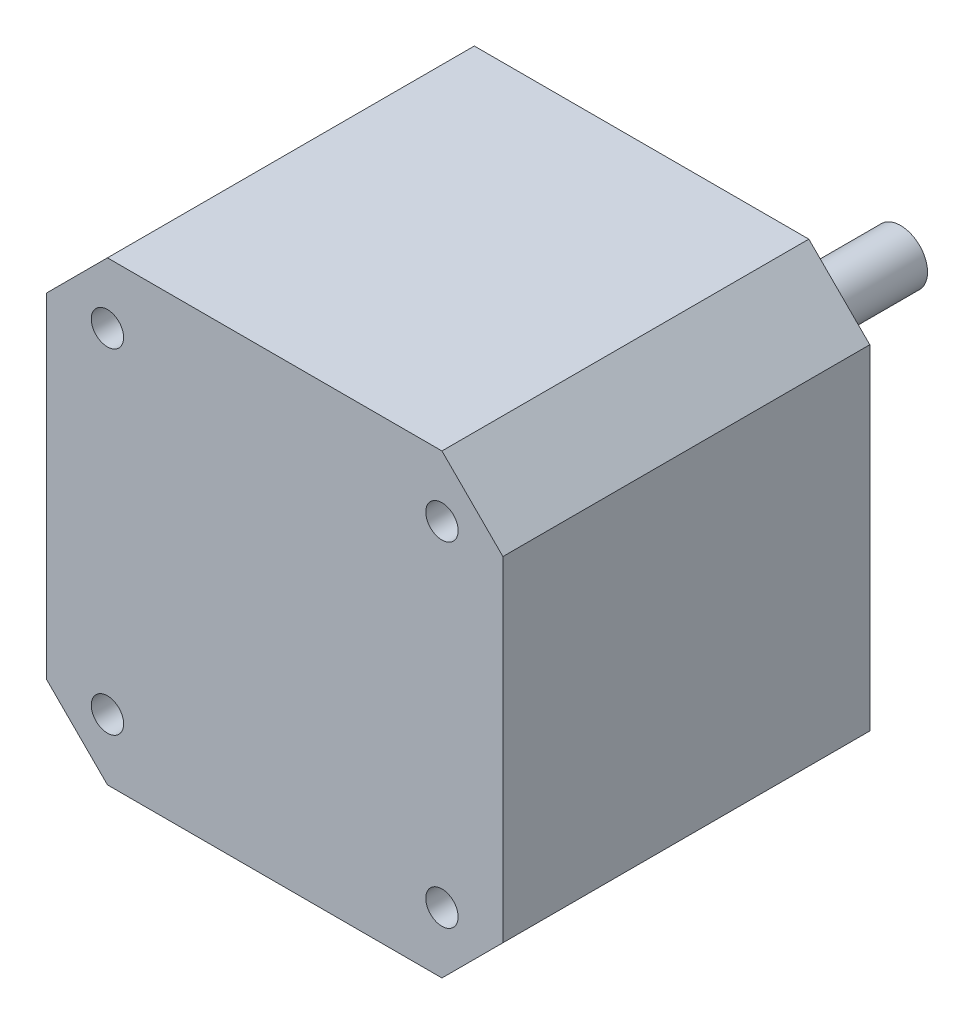
ISO-10303-21;
HEADER;
FILE_DESCRIPTION(('STEP AP214'),'2;1');
FILE_NAME('part.step','',(''),(''),'','','');
FILE_SCHEMA(('AUTOMOTIVE_DESIGN { 1 0 10303 214 1 1 1 1 }'));
ENDSEC;
DATA;
#1=APPLICATION_CONTEXT('core data for automotive mechanical design processes');
#2=APPLICATION_PROTOCOL_DEFINITION('international standard','automotive_design',2000,#1);
#3=PRODUCT_CONTEXT('',#1,'mechanical');
#4=PRODUCT('Part','Part','',(#3));
#5=PRODUCT_RELATED_PRODUCT_CATEGORY('part','',(#4));
#6=PRODUCT_DEFINITION_FORMATION('','',#4);
#7=PRODUCT_DEFINITION_CONTEXT('part definition',#1,'design');
#8=PRODUCT_DEFINITION('design','',#6,#7);
#9=PRODUCT_DEFINITION_SHAPE('','',#8);
#10=(LENGTH_UNIT() NAMED_UNIT(*) SI_UNIT(.MILLI.,.METRE.));
#11=(NAMED_UNIT(*) PLANE_ANGLE_UNIT() SI_UNIT($,.RADIAN.));
#12=(NAMED_UNIT(*) SI_UNIT($,.STERADIAN.) SOLID_ANGLE_UNIT());
#13=UNCERTAINTY_MEASURE_WITH_UNIT(LENGTH_MEASURE(1.E-05),#10,'distance_accuracy_value','');
#14=(GEOMETRIC_REPRESENTATION_CONTEXT(3) GLOBAL_UNCERTAINTY_ASSIGNED_CONTEXT((#13)) GLOBAL_UNIT_ASSIGNED_CONTEXT((#10,
#11,#12)) REPRESENTATION_CONTEXT('',''));
#15=CARTESIAN_POINT('',(0.,0.,0.));
#16=DIRECTION('',(0.,0.,1.));
#17=DIRECTION('',(1.,0.,0.));
#18=AXIS2_PLACEMENT_3D('',#15,#16,#17);
#19=CARTESIAN_POINT('',(0.,0.,34.));
#20=DIRECTION('',(0.,0.,1.));
#21=DIRECTION('',(1.,0.,0.));
#22=AXIS2_PLACEMENT_3D('',#19,#20,#21);
#23=PLANE('',#22);
#24=CARTESIAN_POINT('',(-15.4999999999991,-15.5000000000009,34.));
#25=DIRECTION('',(0.,0.,1.));
#26=DIRECTION('',(1.,0.,0.));
#27=AXIS2_PLACEMENT_3D('',#24,#25,#26);
#28=CIRCLE('',#27,1.50000000000065);
#29=CARTESIAN_POINT('',(-13.9999999999985,-15.5000000000009,34.));
#30=VERTEX_POINT('',#29);
#31=EDGE_CURVE('E188',#30,#30,#28,.T.);
#32=ORIENTED_EDGE('',*,*,#31,.F.);
#33=EDGE_LOOP('',(#32));
#34=FACE_BOUND('',#33,.T.);
#35=CARTESIAN_POINT('',(15.5,15.5,34.));
#36=DIRECTION('',(0.,0.,1.));
#37=DIRECTION('',(1.,0.,0.));
#38=AXIS2_PLACEMENT_3D('',#35,#36,#37);
#39=CIRCLE('',#38,1.5);
#40=CARTESIAN_POINT('',(17.,15.5,34.));
#41=VERTEX_POINT('',#40);
#42=EDGE_CURVE('E134',#41,#41,#39,.T.);
#43=ORIENTED_EDGE('',*,*,#42,.F.);
#44=EDGE_LOOP('',(#43));
#45=FACE_BOUND('',#44,.T.);
#46=DIRECTION('',(-1.,0.,0.));
#47=VECTOR('',#46,1.);
#48=CARTESIAN_POINT('',(-15.5000000000006,21.1499999999994,34.));
#49=LINE('',#48,#47);
#50=CARTESIAN_POINT('',(15.5000000000006,21.1499999999994,34.));
#51=VERTEX_POINT('',#50);
#52=CARTESIAN_POINT('',(-15.5000000000006,21.1499999999994,34.));
#53=VERTEX_POINT('',#52);
#54=EDGE_CURVE('E145',#51,#53,#49,.T.);
#55=ORIENTED_EDGE('',*,*,#54,.T.);
#56=DIRECTION('',(-0.707106781186547,-0.707106781186548,0.));
#57=VECTOR('',#56,1.);
#58=CARTESIAN_POINT('',(-15.5000000000006,21.1499999999994,34.));
#59=LINE('',#58,#57);
#60=CARTESIAN_POINT('',(-21.1499999999993,15.5000000000006,34.));
#61=VERTEX_POINT('',#60);
#62=EDGE_CURVE('E93',#53,#61,#59,.T.);
#63=ORIENTED_EDGE('',*,*,#62,.T.);
#64=DIRECTION('',(0.,-1.,0.));
#65=VECTOR('',#64,1.);
#66=CARTESIAN_POINT('',(-21.1499999999993,-15.5000000000006,34.));
#67=LINE('',#66,#65);
#68=CARTESIAN_POINT('',(-21.1499999999993,-15.5000000000006,34.));
#69=VERTEX_POINT('',#68);
#70=EDGE_CURVE('E160',#61,#69,#67,.T.);
#71=ORIENTED_EDGE('',*,*,#70,.T.);
#72=DIRECTION('',(0.707106781186548,-0.707106781186547,0.));
#73=VECTOR('',#72,1.);
#74=CARTESIAN_POINT('',(-21.1499999999993,-15.5000000000006,34.));
#75=LINE('',#74,#73);
#76=CARTESIAN_POINT('',(-15.5000000000006,-21.1499999999993,34.));
#77=VERTEX_POINT('',#76);
#78=EDGE_CURVE('E173',#69,#77,#75,.T.);
#79=ORIENTED_EDGE('',*,*,#78,.T.);
#80=DIRECTION('',(1.,0.,0.));
#81=VECTOR('',#80,1.);
#82=CARTESIAN_POINT('',(-15.5000000000006,-21.1499999999993,34.));
#83=LINE('',#82,#81);
#84=CARTESIAN_POINT('',(15.5000000000006,-21.1499999999993,34.));
#85=VERTEX_POINT('',#84);
#86=EDGE_CURVE('E112',#77,#85,#83,.T.);
#87=ORIENTED_EDGE('',*,*,#86,.T.);
#88=DIRECTION('',(0.707106781186548,0.707106781186548,0.));
#89=VECTOR('',#88,1.);
#90=CARTESIAN_POINT('',(15.5000000000006,-21.1499999999993,34.));
#91=LINE('',#90,#89);
#92=CARTESIAN_POINT('',(21.1499999999994,-15.5000000000006,34.));
#93=VERTEX_POINT('',#92);
#94=EDGE_CURVE('E106',#85,#93,#91,.T.);
#95=ORIENTED_EDGE('',*,*,#94,.T.);
#96=DIRECTION('',(0.,1.,0.));
#97=VECTOR('',#96,1.);
#98=CARTESIAN_POINT('',(21.1499999999994,-15.5000000000006,34.));
#99=LINE('',#98,#97);
#100=CARTESIAN_POINT('',(21.1499999999994,15.5000000000006,34.));
#101=VERTEX_POINT('',#100);
#102=EDGE_CURVE('E110',#93,#101,#99,.T.);
#103=ORIENTED_EDGE('',*,*,#102,.T.);
#104=DIRECTION('',(-0.707106781186548,0.707106781186547,0.));
#105=VECTOR('',#104,1.);
#106=CARTESIAN_POINT('',(21.1499999999994,15.5000000000006,34.));
#107=LINE('',#106,#105);
#108=EDGE_CURVE('E50',#101,#51,#107,.T.);
#109=ORIENTED_EDGE('',*,*,#108,.T.);
#110=EDGE_LOOP('',(#55,#63,#71,#79,#87,#95,#103,#109));
#111=FACE_BOUND('',#110,.T.);
#112=CARTESIAN_POINT('',(15.5000000000009,-15.5,34.));
#113=DIRECTION('',(0.,0.,1.));
#114=DIRECTION('',(1.,0.,0.));
#115=AXIS2_PLACEMENT_3D('',#112,#113,#114);
#116=CIRCLE('',#115,1.49999999999978);
#117=CARTESIAN_POINT('',(17.0000000000007,-15.5,34.));
#118=VERTEX_POINT('',#117);
#119=EDGE_CURVE('E182',#118,#118,#116,.T.);
#120=ORIENTED_EDGE('',*,*,#119,.F.);
#121=EDGE_LOOP('',(#120));
#122=FACE_BOUND('',#121,.T.);
#123=CARTESIAN_POINT('',(-15.5,15.4999999999991,34.));
#124=DIRECTION('',(0.,0.,1.));
#125=DIRECTION('',(1.,0.,0.));
#126=AXIS2_PLACEMENT_3D('',#123,#124,#125);
#127=CIRCLE('',#126,1.50000000000094);
#128=CARTESIAN_POINT('',(-13.9999999999991,15.4999999999991,34.));
#129=VERTEX_POINT('',#128);
#130=EDGE_CURVE('E194',#129,#129,#127,.T.);
#131=ORIENTED_EDGE('',*,*,#130,.F.);
#132=EDGE_LOOP('',(#131));
#133=FACE_BOUND('',#132,.T.);
#134=ADVANCED_FACE('F33',(#34,#45,#111,#122,#133),#23,.T.);
#135=CARTESIAN_POINT('',(0.,0.,0.));
#136=DIRECTION('',(0.,0.,1.));
#137=DIRECTION('',(1.,0.,0.));
#138=AXIS2_PLACEMENT_3D('',#135,#136,#137);
#139=PLANE('',#138);
#140=CARTESIAN_POINT('',(0.,0.,0.));
#141=DIRECTION('',(0.,0.,1.));
#142=DIRECTION('',(1.,0.,0.));
#143=AXIS2_PLACEMENT_3D('',#140,#141,#142);
#144=CIRCLE('',#143,11.);
#145=CARTESIAN_POINT('',(11.,0.,0.));
#146=VERTEX_POINT('',#145);
#147=EDGE_CURVE('E200',#146,#146,#144,.T.);
#148=ORIENTED_EDGE('',*,*,#147,.T.);
#149=EDGE_LOOP('',(#148));
#150=FACE_BOUND('',#149,.T.);
#151=DIRECTION('',(-1.,0.,0.));
#152=VECTOR('',#151,1.);
#153=CARTESIAN_POINT('',(-15.5000000000006,21.1499999999994,0.));
#154=LINE('',#153,#152);
#155=CARTESIAN_POINT('',(15.5000000000006,21.1499999999994,0.));
#156=VERTEX_POINT('',#155);
#157=CARTESIAN_POINT('',(-15.5000000000006,21.1499999999994,0.));
#158=VERTEX_POINT('',#157);
#159=EDGE_CURVE('E130',#156,#158,#154,.T.);
#160=ORIENTED_EDGE('',*,*,#159,.F.);
#161=DIRECTION('',(-0.707106781186548,0.707106781186547,0.));
#162=VECTOR('',#161,1.);
#163=CARTESIAN_POINT('',(21.1499999999994,15.5000000000006,0.));
#164=LINE('',#163,#162);
#165=CARTESIAN_POINT('',(21.1499999999994,15.5000000000006,0.));
#166=VERTEX_POINT('',#165);
#167=EDGE_CURVE('E85',#166,#156,#164,.T.);
#168=ORIENTED_EDGE('',*,*,#167,.F.);
#169=DIRECTION('',(0.,1.,0.));
#170=VECTOR('',#169,1.);
#171=CARTESIAN_POINT('',(21.1499999999994,-15.5000000000006,0.));
#172=LINE('',#171,#170);
#173=CARTESIAN_POINT('',(21.1499999999994,-15.5000000000006,0.));
#174=VERTEX_POINT('',#173);
#175=EDGE_CURVE('E79',#174,#166,#172,.T.);
#176=ORIENTED_EDGE('',*,*,#175,.F.);
#177=DIRECTION('',(0.707106781186548,0.707106781186548,0.));
#178=VECTOR('',#177,1.);
#179=CARTESIAN_POINT('',(15.5000000000006,-21.1499999999993,0.));
#180=LINE('',#179,#178);
#181=CARTESIAN_POINT('',(15.5000000000006,-21.1499999999993,0.));
#182=VERTEX_POINT('',#181);
#183=EDGE_CURVE('E120',#182,#174,#180,.T.);
#184=ORIENTED_EDGE('',*,*,#183,.F.);
#185=DIRECTION('',(1.,0.,0.));
#186=VECTOR('',#185,1.);
#187=CARTESIAN_POINT('',(-15.5000000000006,-21.1499999999993,0.));
#188=LINE('',#187,#186);
#189=CARTESIAN_POINT('',(-15.5000000000006,-21.1499999999993,0.));
#190=VERTEX_POINT('',#189);
#191=EDGE_CURVE('E140',#190,#182,#188,.T.);
#192=ORIENTED_EDGE('',*,*,#191,.F.);
#193=DIRECTION('',(0.707106781186548,-0.707106781186547,0.));
#194=VECTOR('',#193,1.);
#195=CARTESIAN_POINT('',(-21.1499999999993,-15.5000000000006,0.));
#196=LINE('',#195,#194);
#197=CARTESIAN_POINT('',(-21.1499999999993,-15.5000000000006,0.));
#198=VERTEX_POINT('',#197);
#199=EDGE_CURVE('E138',#198,#190,#196,.T.);
#200=ORIENTED_EDGE('',*,*,#199,.F.);
#201=DIRECTION('',(0.,-1.,0.));
#202=VECTOR('',#201,1.);
#203=CARTESIAN_POINT('',(-21.1499999999993,-15.5000000000006,0.));
#204=LINE('',#203,#202);
#205=CARTESIAN_POINT('',(-21.1499999999993,15.5000000000006,0.));
#206=VERTEX_POINT('',#205);
#207=EDGE_CURVE('E136',#206,#198,#204,.T.);
#208=ORIENTED_EDGE('',*,*,#207,.F.);
#209=DIRECTION('',(-0.707106781186547,-0.707106781186548,0.));
#210=VECTOR('',#209,1.);
#211=CARTESIAN_POINT('',(-15.5000000000006,21.1499999999994,0.));
#212=LINE('',#211,#210);
#213=EDGE_CURVE('E133',#158,#206,#212,.T.);
#214=ORIENTED_EDGE('',*,*,#213,.F.);
#215=EDGE_LOOP('',(#160,#168,#176,#184,#192,#200,#208,#214));
#216=FACE_BOUND('',#215,.T.);
#217=CARTESIAN_POINT('',(15.5,15.5,0.));
#218=DIRECTION('',(0.,0.,1.));
#219=DIRECTION('',(1.,0.,0.));
#220=AXIS2_PLACEMENT_3D('',#217,#218,#219);
#221=CIRCLE('',#220,1.5);
#222=CARTESIAN_POINT('',(17.,15.5,0.));
#223=VERTEX_POINT('',#222);
#224=EDGE_CURVE('E179',#223,#223,#221,.T.);
#225=ORIENTED_EDGE('',*,*,#224,.T.);
#226=EDGE_LOOP('',(#225));
#227=FACE_BOUND('',#226,.T.);
#228=CARTESIAN_POINT('',(15.5000000000009,-15.5,0.));
#229=DIRECTION('',(0.,0.,1.));
#230=DIRECTION('',(1.,0.,0.));
#231=AXIS2_PLACEMENT_3D('',#228,#229,#230);
#232=CIRCLE('',#231,1.49999999999978);
#233=CARTESIAN_POINT('',(17.0000000000007,-15.5,0.));
#234=VERTEX_POINT('',#233);
#235=EDGE_CURVE('E185',#234,#234,#232,.T.);
#236=ORIENTED_EDGE('',*,*,#235,.T.);
#237=EDGE_LOOP('',(#236));
#238=FACE_BOUND('',#237,.T.);
#239=CARTESIAN_POINT('',(-15.4999999999991,-15.5000000000009,0.));
#240=DIRECTION('',(0.,0.,1.));
#241=DIRECTION('',(1.,0.,0.));
#242=AXIS2_PLACEMENT_3D('',#239,#240,#241);
#243=CIRCLE('',#242,1.50000000000065);
#244=CARTESIAN_POINT('',(-13.9999999999985,-15.5000000000009,0.));
#245=VERTEX_POINT('',#244);
#246=EDGE_CURVE('E191',#245,#245,#243,.T.);
#247=ORIENTED_EDGE('',*,*,#246,.T.);
#248=EDGE_LOOP('',(#247));
#249=FACE_BOUND('',#248,.T.);
#250=CARTESIAN_POINT('',(-15.5,15.4999999999991,0.));
#251=DIRECTION('',(0.,0.,1.));
#252=DIRECTION('',(1.,0.,0.));
#253=AXIS2_PLACEMENT_3D('',#250,#251,#252);
#254=CIRCLE('',#253,1.50000000000094);
#255=CARTESIAN_POINT('',(-13.9999999999991,15.4999999999991,0.));
#256=VERTEX_POINT('',#255);
#257=EDGE_CURVE('E197',#256,#256,#254,.T.);
#258=ORIENTED_EDGE('',*,*,#257,.T.);
#259=EDGE_LOOP('',(#258));
#260=FACE_BOUND('',#259,.T.);
#261=ADVANCED_FACE('F164',(#150,#216,#227,#238,#249,#260),#139,.F.);
#262=CARTESIAN_POINT('',(-15.5000000000006,21.1499999999994,34.));
#263=DIRECTION('',(0.,-1.,0.));
#264=DIRECTION('',(1.,0.,0.));
#265=AXIS2_PLACEMENT_3D('',#262,#263,#264);
#266=PLANE('',#265);
#267=ORIENTED_EDGE('',*,*,#159,.T.);
#268=DIRECTION('',(0.,0.,-1.));
#269=VECTOR('',#268,1.);
#270=CARTESIAN_POINT('',(-15.5000000000006,21.1499999999994,34.));
#271=LINE('',#270,#269);
#272=EDGE_CURVE('E11',#53,#158,#271,.T.);
#273=ORIENTED_EDGE('',*,*,#272,.F.);
#274=ORIENTED_EDGE('',*,*,#54,.F.);
#275=DIRECTION('',(0.,0.,-1.));
#276=VECTOR('',#275,1.);
#277=CARTESIAN_POINT('',(15.5000000000006,21.1499999999994,34.));
#278=LINE('',#277,#276);
#279=EDGE_CURVE('E126',#51,#156,#278,.T.);
#280=ORIENTED_EDGE('',*,*,#279,.T.);
#281=EDGE_LOOP('',(#267,#273,#274,#280));
#282=FACE_BOUND('',#281,.T.);
#283=ADVANCED_FACE('F35',(#282),#266,.F.);
#284=CARTESIAN_POINT('',(-15.5000000000006,21.1499999999994,34.));
#285=DIRECTION('',(0.707106781186548,-0.707106781186547,0.));
#286=DIRECTION('',(0.707106781186547,0.707106781186548,0.));
#287=AXIS2_PLACEMENT_3D('',#284,#285,#286);
#288=PLANE('',#287);
#289=ORIENTED_EDGE('',*,*,#213,.T.);
#290=DIRECTION('',(0.,0.,-1.));
#291=VECTOR('',#290,1.);
#292=CARTESIAN_POINT('',(-21.1499999999993,15.5000000000006,34.));
#293=LINE('',#292,#291);
#294=EDGE_CURVE('E42',#61,#206,#293,.T.);
#295=ORIENTED_EDGE('',*,*,#294,.F.);
#296=ORIENTED_EDGE('',*,*,#62,.F.);
#297=ORIENTED_EDGE('',*,*,#272,.T.);
#298=EDGE_LOOP('',(#289,#295,#296,#297));
#299=FACE_BOUND('',#298,.T.);
#300=ADVANCED_FACE('F264',(#299),#288,.F.);
#301=CARTESIAN_POINT('',(-21.1499999999993,-15.5000000000006,34.));
#302=DIRECTION('',(1.,0.,0.));
#303=DIRECTION('',(0.,0.,-1.));
#304=AXIS2_PLACEMENT_3D('',#301,#302,#303);
#305=PLANE('',#304);
#306=ORIENTED_EDGE('',*,*,#207,.T.);
#307=DIRECTION('',(0.,0.,-1.));
#308=VECTOR('',#307,1.);
#309=CARTESIAN_POINT('',(-21.1499999999993,-15.5000000000006,34.));
#310=LINE('',#309,#308);
#311=EDGE_CURVE('E152',#69,#198,#310,.T.);
#312=ORIENTED_EDGE('',*,*,#311,.F.);
#313=ORIENTED_EDGE('',*,*,#70,.F.);
#314=ORIENTED_EDGE('',*,*,#294,.T.);
#315=EDGE_LOOP('',(#306,#312,#313,#314));
#316=FACE_BOUND('',#315,.T.);
#317=ADVANCED_FACE('F158',(#316),#305,.F.);
#318=CARTESIAN_POINT('',(-21.1499999999993,-15.5000000000006,34.));
#319=DIRECTION('',(0.707106781186547,0.707106781186548,0.));
#320=DIRECTION('',(-0.707106781186548,0.707106781186547,0.));
#321=AXIS2_PLACEMENT_3D('',#318,#319,#320);
#322=PLANE('',#321);
#323=ORIENTED_EDGE('',*,*,#199,.T.);
#324=DIRECTION('',(0.,0.,-1.));
#325=VECTOR('',#324,1.);
#326=CARTESIAN_POINT('',(-15.5000000000006,-21.1499999999993,34.));
#327=LINE('',#326,#325);
#328=EDGE_CURVE('E149',#77,#190,#327,.T.);
#329=ORIENTED_EDGE('',*,*,#328,.F.);
#330=ORIENTED_EDGE('',*,*,#78,.F.);
#331=ORIENTED_EDGE('',*,*,#311,.T.);
#332=EDGE_LOOP('',(#323,#329,#330,#331));
#333=FACE_BOUND('',#332,.T.);
#334=ADVANCED_FACE('F169',(#333),#322,.F.);
#335=CARTESIAN_POINT('',(-15.5000000000006,-21.1499999999993,34.));
#336=DIRECTION('',(0.,1.,0.));
#337=DIRECTION('',(-1.,0.,0.));
#338=AXIS2_PLACEMENT_3D('',#335,#336,#337);
#339=PLANE('',#338);
#340=ORIENTED_EDGE('',*,*,#191,.T.);
#341=DIRECTION('',(0.,0.,-1.));
#342=VECTOR('',#341,1.);
#343=CARTESIAN_POINT('',(15.5000000000006,-21.1499999999993,34.));
#344=LINE('',#343,#342);
#345=EDGE_CURVE('E121',#85,#182,#344,.T.);
#346=ORIENTED_EDGE('',*,*,#345,.F.);
#347=ORIENTED_EDGE('',*,*,#86,.F.);
#348=ORIENTED_EDGE('',*,*,#328,.T.);
#349=EDGE_LOOP('',(#340,#346,#347,#348));
#350=FACE_BOUND('',#349,.T.);
#351=ADVANCED_FACE('F172',(#350),#339,.F.);
#352=CARTESIAN_POINT('',(15.5000000000006,-21.1499999999993,34.));
#353=DIRECTION('',(-0.707106781186547,0.707106781186547,0.));
#354=DIRECTION('',(-0.707106781186548,-0.707106781186548,0.));
#355=AXIS2_PLACEMENT_3D('',#352,#353,#354);
#356=PLANE('',#355);
#357=ORIENTED_EDGE('',*,*,#183,.T.);
#358=DIRECTION('',(0.,0.,-1.));
#359=VECTOR('',#358,1.);
#360=CARTESIAN_POINT('',(21.1499999999994,-15.5000000000006,34.));
#361=LINE('',#360,#359);
#362=EDGE_CURVE('E117',#93,#174,#361,.T.);
#363=ORIENTED_EDGE('',*,*,#362,.F.);
#364=ORIENTED_EDGE('',*,*,#94,.F.);
#365=ORIENTED_EDGE('',*,*,#345,.T.);
#366=EDGE_LOOP('',(#357,#363,#364,#365));
#367=FACE_BOUND('',#366,.T.);
#368=ADVANCED_FACE('F118',(#367),#356,.F.);
#369=CARTESIAN_POINT('',(21.1499999999994,-15.5000000000006,34.));
#370=DIRECTION('',(-1.,0.,0.));
#371=DIRECTION('',(0.,-1.,0.));
#372=AXIS2_PLACEMENT_3D('',#369,#370,#371);
#373=PLANE('',#372);
#374=ORIENTED_EDGE('',*,*,#175,.T.);
#375=DIRECTION('',(0.,0.,-1.));
#376=VECTOR('',#375,1.);
#377=CARTESIAN_POINT('',(21.1499999999994,15.5000000000006,34.));
#378=LINE('',#377,#376);
#379=EDGE_CURVE('E122',#101,#166,#378,.T.);
#380=ORIENTED_EDGE('',*,*,#379,.F.);
#381=ORIENTED_EDGE('',*,*,#102,.F.);
#382=ORIENTED_EDGE('',*,*,#362,.T.);
#383=EDGE_LOOP('',(#374,#380,#381,#382));
#384=FACE_BOUND('',#383,.T.);
#385=ADVANCED_FACE('F124',(#384),#373,.F.);
#386=CARTESIAN_POINT('',(21.1499999999994,15.5000000000006,34.));
#387=DIRECTION('',(-0.707106781186547,-0.707106781186548,0.));
#388=DIRECTION('',(0.707106781186548,-0.707106781186547,0.));
#389=AXIS2_PLACEMENT_3D('',#386,#387,#388);
#390=PLANE('',#389);
#391=ORIENTED_EDGE('',*,*,#167,.T.);
#392=ORIENTED_EDGE('',*,*,#279,.F.);
#393=ORIENTED_EDGE('',*,*,#108,.F.);
#394=ORIENTED_EDGE('',*,*,#379,.T.);
#395=EDGE_LOOP('',(#391,#392,#393,#394));
#396=FACE_BOUND('',#395,.T.);
#397=ADVANCED_FACE('F252',(#396),#390,.F.);
#398=CARTESIAN_POINT('',(15.5,15.5,34.));
#399=DIRECTION('',(0.,0.,-1.));
#400=DIRECTION('',(-1.,0.,0.));
#401=AXIS2_PLACEMENT_3D('',#398,#399,#400);
#402=CYLINDRICAL_SURFACE('',#401,1.5);
#403=ORIENTED_EDGE('',*,*,#42,.T.);
#404=EDGE_LOOP('',(#403));
#405=FACE_BOUND('',#404,.T.);
#406=ORIENTED_EDGE('',*,*,#224,.F.);
#407=EDGE_LOOP('',(#406));
#408=FACE_BOUND('',#407,.T.);
#409=ADVANCED_FACE('F249',(#405,#408),#402,.F.);
#410=CARTESIAN_POINT('',(15.5000000000009,-15.5,34.));
#411=DIRECTION('',(0.,0.,-1.));
#412=DIRECTION('',(-1.,0.,0.));
#413=AXIS2_PLACEMENT_3D('',#410,#411,#412);
#414=CYLINDRICAL_SURFACE('',#413,1.49999999999978);
#415=ORIENTED_EDGE('',*,*,#119,.T.);
#416=EDGE_LOOP('',(#415));
#417=FACE_BOUND('',#416,.T.);
#418=ORIENTED_EDGE('',*,*,#235,.F.);
#419=EDGE_LOOP('',(#418));
#420=FACE_BOUND('',#419,.T.);
#421=ADVANCED_FACE('F317',(#417,#420),#414,.F.);
#422=CARTESIAN_POINT('',(-15.4999999999991,-15.5000000000009,34.));
#423=DIRECTION('',(0.,0.,-1.));
#424=DIRECTION('',(-1.,0.,0.));
#425=AXIS2_PLACEMENT_3D('',#422,#423,#424);
#426=CYLINDRICAL_SURFACE('',#425,1.50000000000065);
#427=ORIENTED_EDGE('',*,*,#31,.T.);
#428=EDGE_LOOP('',(#427));
#429=FACE_BOUND('',#428,.T.);
#430=ORIENTED_EDGE('',*,*,#246,.F.);
#431=EDGE_LOOP('',(#430));
#432=FACE_BOUND('',#431,.T.);
#433=ADVANCED_FACE('F312',(#429,#432),#426,.F.);
#434=CARTESIAN_POINT('',(-15.5,15.4999999999991,34.));
#435=DIRECTION('',(0.,0.,-1.));
#436=DIRECTION('',(-1.,0.,0.));
#437=AXIS2_PLACEMENT_3D('',#434,#435,#436);
#438=CYLINDRICAL_SURFACE('',#437,1.50000000000094);
#439=ORIENTED_EDGE('',*,*,#130,.T.);
#440=EDGE_LOOP('',(#439));
#441=FACE_BOUND('',#440,.T.);
#442=ORIENTED_EDGE('',*,*,#257,.F.);
#443=EDGE_LOOP('',(#442));
#444=FACE_BOUND('',#443,.T.);
#445=ADVANCED_FACE('F235',(#441,#444),#438,.F.);
#446=CARTESIAN_POINT('',(0.,0.,0.));
#447=DIRECTION('',(0.,0.,1.));
#448=DIRECTION('',(1.,0.,0.));
#449=AXIS2_PLACEMENT_3D('',#446,#447,#448);
#450=CYLINDRICAL_SURFACE('',#449,11.);
#451=ORIENTED_EDGE('',*,*,#147,.F.);
#452=EDGE_LOOP('',(#451));
#453=FACE_BOUND('',#452,.T.);
#454=CARTESIAN_POINT('',(0.,0.,-2.));
#455=DIRECTION('',(0.,0.,1.));
#456=DIRECTION('',(1.,0.,0.));
#457=AXIS2_PLACEMENT_3D('',#454,#455,#456);
#458=CIRCLE('',#457,11.);
#459=CARTESIAN_POINT('',(11.,0.,-2.));
#460=VERTEX_POINT('',#459);
#461=EDGE_CURVE('E211',#460,#460,#458,.T.);
#462=ORIENTED_EDGE('',*,*,#461,.T.);
#463=EDGE_LOOP('',(#462));
#464=FACE_BOUND('',#463,.T.);
#465=ADVANCED_FACE('F215',(#453,#464),#450,.T.);
#466=CARTESIAN_POINT('',(0.,0.,-24.));
#467=DIRECTION('',(0.,0.,1.));
#468=DIRECTION('',(1.,0.,0.));
#469=AXIS2_PLACEMENT_3D('',#466,#467,#468);
#470=PLANE('',#469);
#471=CARTESIAN_POINT('',(0.,0.,-24.));
#472=DIRECTION('',(0.,0.,1.));
#473=DIRECTION('',(1.,0.,0.));
#474=AXIS2_PLACEMENT_3D('',#471,#472,#473);
#475=CIRCLE('',#474,2.5);
#476=CARTESIAN_POINT('',(2.5,0.,-24.));
#477=VERTEX_POINT('',#476);
#478=EDGE_CURVE('E205',#477,#477,#475,.T.);
#479=ORIENTED_EDGE('',*,*,#478,.F.);
#480=EDGE_LOOP('',(#479));
#481=FACE_BOUND('',#480,.T.);
#482=ADVANCED_FACE('F226',(#481),#470,.F.);
#483=CARTESIAN_POINT('',(0.,0.,0.));
#484=DIRECTION('',(0.,0.,1.));
#485=DIRECTION('',(1.,0.,0.));
#486=AXIS2_PLACEMENT_3D('',#483,#484,#485);
#487=CYLINDRICAL_SURFACE('',#486,2.5);
#488=CARTESIAN_POINT('',(0.,0.,-2.));
#489=DIRECTION('',(0.,0.,1.));
#490=DIRECTION('',(1.,0.,0.));
#491=AXIS2_PLACEMENT_3D('',#488,#489,#490);
#492=CIRCLE('',#491,2.5);
#493=CARTESIAN_POINT('',(2.5,0.,-2.));
#494=VERTEX_POINT('',#493);
#495=EDGE_CURVE('E208',#494,#494,#492,.T.);
#496=ORIENTED_EDGE('',*,*,#495,.F.);
#497=EDGE_LOOP('',(#496));
#498=FACE_BOUND('',#497,.T.);
#499=ORIENTED_EDGE('',*,*,#478,.T.);
#500=EDGE_LOOP('',(#499));
#501=FACE_BOUND('',#500,.T.);
#502=ADVANCED_FACE('F220',(#498,#501),#487,.T.);
#503=CARTESIAN_POINT('',(0.,2.5,-2.));
#504=DIRECTION('',(0.,0.,1.));
#505=DIRECTION('',(1.,0.,0.));
#506=AXIS2_PLACEMENT_3D('',#503,#504,#505);
#507=PLANE('',#506);
#508=ORIENTED_EDGE('',*,*,#461,.F.);
#509=EDGE_LOOP('',(#508));
#510=FACE_BOUND('',#509,.T.);
#511=ORIENTED_EDGE('',*,*,#495,.T.);
#512=EDGE_LOOP('',(#511));
#513=FACE_BOUND('',#512,.T.);
#514=ADVANCED_FACE('F217',(#510,#513),#507,.F.);
#515=CLOSED_SHELL('',(#134,#261,#283,#300,#317,#334,#351,#368,#385,#397,#409,#421,#433,#445,
#465,#482,#502,#514));
#516=MANIFOLD_SOLID_BREP('B2',#515);
#517=ADVANCED_BREP_SHAPE_REPRESENTATION('',(#18,#516),#14);
#518=SHAPE_DEFINITION_REPRESENTATION(#9,#517);
ENDSEC;
END-ISO-10303-21;
